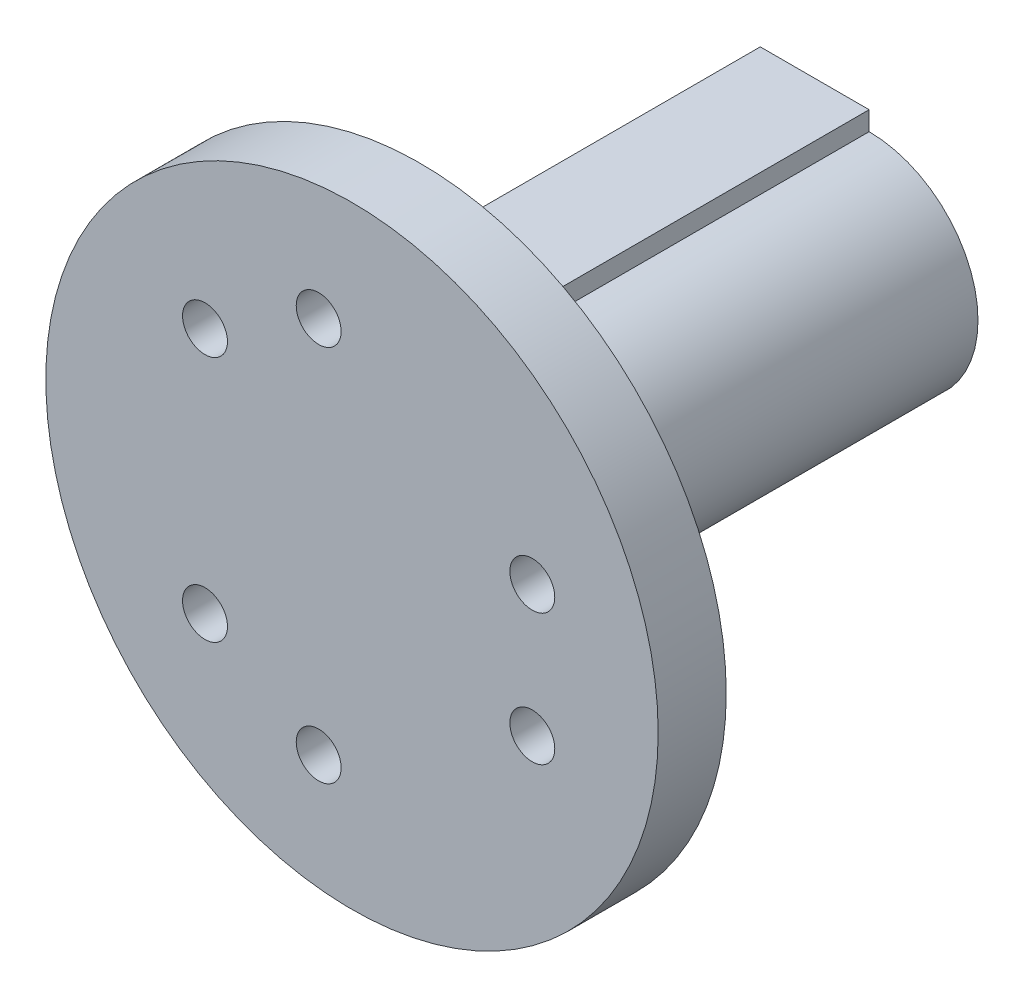
ISO-10303-21;
HEADER;
FILE_DESCRIPTION(('STEP AP214'),'2;1');
FILE_NAME('part.step','',(''),(''),'','','');
FILE_SCHEMA(('AUTOMOTIVE_DESIGN { 1 0 10303 214 1 1 1 1 }'));
ENDSEC;
DATA;
#1=APPLICATION_CONTEXT('core data for automotive mechanical design processes');
#2=APPLICATION_PROTOCOL_DEFINITION('international standard','automotive_design',2000,#1);
#3=PRODUCT_CONTEXT('',#1,'mechanical');
#4=PRODUCT('Part','Part','',(#3));
#5=PRODUCT_RELATED_PRODUCT_CATEGORY('part','',(#4));
#6=PRODUCT_DEFINITION_FORMATION('','',#4);
#7=PRODUCT_DEFINITION_CONTEXT('part definition',#1,'design');
#8=PRODUCT_DEFINITION('design','',#6,#7);
#9=PRODUCT_DEFINITION_SHAPE('','',#8);
#10=(LENGTH_UNIT() NAMED_UNIT(*) SI_UNIT(.MILLI.,.METRE.));
#11=(NAMED_UNIT(*) PLANE_ANGLE_UNIT() SI_UNIT($,.RADIAN.));
#12=(NAMED_UNIT(*) SI_UNIT($,.STERADIAN.) SOLID_ANGLE_UNIT());
#13=UNCERTAINTY_MEASURE_WITH_UNIT(LENGTH_MEASURE(1.E-05),#10,'distance_accuracy_value','');
#14=(GEOMETRIC_REPRESENTATION_CONTEXT(3) GLOBAL_UNCERTAINTY_ASSIGNED_CONTEXT((#13)) GLOBAL_UNIT_ASSIGNED_CONTEXT((#10,
#11,#12)) REPRESENTATION_CONTEXT('',''));
#15=CARTESIAN_POINT('',(0.,0.,0.));
#16=DIRECTION('',(0.,0.,1.));
#17=DIRECTION('',(1.,0.,0.));
#18=AXIS2_PLACEMENT_3D('',#15,#16,#17);
#19=CARTESIAN_POINT('',(0.,0.,-25.));
#20=DIRECTION('',(0.,0.,1.));
#21=DIRECTION('',(1.,0.,0.));
#22=AXIS2_PLACEMENT_3D('',#19,#20,#21);
#23=CYLINDRICAL_SURFACE('',#22,8.);
#24=CARTESIAN_POINT('',(0.,0.,0.));
#25=DIRECTION('',(0.,0.,1.));
#26=DIRECTION('',(1.,0.,0.));
#27=AXIS2_PLACEMENT_3D('',#24,#25,#26);
#28=CIRCLE('',#27,8.);
#29=CARTESIAN_POINT('',(8.,0.,0.));
#30=VERTEX_POINT('',#29);
#31=EDGE_CURVE('E41',#30,#30,#28,.F.);
#32=ORIENTED_EDGE('',*,*,#31,.T.);
#33=EDGE_LOOP('',(#32));
#34=FACE_BOUND('',#33,.T.);
#35=DIRECTION('',(0.,0.,1.));
#36=VECTOR('',#35,1.);
#37=CARTESIAN_POINT('',(0.,-8.,-25.));
#38=LINE('',#37,#36);
#39=CARTESIAN_POINT('',(0.,-8.,-33.));
#40=VERTEX_POINT('',#39);
#41=CARTESIAN_POINT('',(0.,-8.,-10.));
#42=VERTEX_POINT('',#41);
#43=EDGE_CURVE('E141',#40,#42,#38,.T.);
#44=ORIENTED_EDGE('',*,*,#43,.F.);
#45=CARTESIAN_POINT('',(0.,0.,-33.));
#46=DIRECTION('',(0.,0.,-1.));
#47=DIRECTION('',(-1.,0.,0.));
#48=AXIS2_PLACEMENT_3D('',#45,#46,#47);
#49=CIRCLE('',#48,8.);
#50=CARTESIAN_POINT('',(0.,8.,-33.));
#51=VERTEX_POINT('',#50);
#52=EDGE_CURVE('E99',#51,#40,#49,.T.);
#53=ORIENTED_EDGE('',*,*,#52,.F.);
#54=DIRECTION('',(0.,0.,1.));
#55=VECTOR('',#54,1.);
#56=CARTESIAN_POINT('',(0.,8.,-25.));
#57=LINE('',#56,#55);
#58=CARTESIAN_POINT('',(0.,8.,-10.));
#59=VERTEX_POINT('',#58);
#60=EDGE_CURVE('E139',#59,#51,#57,.F.);
#61=ORIENTED_EDGE('',*,*,#60,.F.);
#62=CARTESIAN_POINT('',(0.,0.,-10.));
#63=DIRECTION('',(0.,0.,-1.));
#64=DIRECTION('',(-1.,0.,0.));
#65=AXIS2_PLACEMENT_3D('',#62,#63,#64);
#66=CIRCLE('',#65,8.);
#67=CARTESIAN_POINT('',(-8.,0.,-10.));
#68=VERTEX_POINT('',#67);
#69=EDGE_CURVE('E53',#68,#59,#66,.T.);
#70=ORIENTED_EDGE('',*,*,#69,.F.);
#71=CARTESIAN_POINT('',(0.,0.,-10.));
#72=DIRECTION('',(0.,0.,-1.));
#73=DIRECTION('',(-1.,0.,0.));
#74=AXIS2_PLACEMENT_3D('',#71,#72,#73);
#75=CIRCLE('',#74,8.);
#76=EDGE_CURVE('E11',#42,#68,#75,.T.);
#77=ORIENTED_EDGE('',*,*,#76,.F.);
#78=EDGE_LOOP('',(#44,#53,#61,#70,#77));
#79=FACE_BOUND('',#78,.T.);
#80=ADVANCED_FACE('F33',(#34,#79),#23,.T.);
#81=CARTESIAN_POINT('',(-10.8012266479776,9.06330529658017,5.));
#82=DIRECTION('',(0.,0.,-1.));
#83=DIRECTION('',(-1.,0.,0.));
#84=AXIS2_PLACEMENT_3D('',#81,#82,#83);
#85=CYLINDRICAL_SURFACE('',#84,1.65);
#86=CARTESIAN_POINT('',(-10.8012266479776,9.06330529658017,5.));
#87=DIRECTION('',(0.,0.,1.));
#88=DIRECTION('',(1.,0.,0.));
#89=AXIS2_PLACEMENT_3D('',#86,#87,#88);
#90=CIRCLE('',#89,1.65);
#91=CARTESIAN_POINT('',(-9.15122664797762,9.06330529658017,5.));
#92=VERTEX_POINT('',#91);
#93=EDGE_CURVE('E194',#92,#92,#90,.T.);
#94=ORIENTED_EDGE('',*,*,#93,.T.);
#95=EDGE_LOOP('',(#94));
#96=FACE_BOUND('',#95,.T.);
#97=CARTESIAN_POINT('',(-10.8012266479776,9.06330529658017,2.));
#98=DIRECTION('',(0.,0.,-1.));
#99=DIRECTION('',(-1.,0.,0.));
#100=AXIS2_PLACEMENT_3D('',#97,#98,#99);
#101=CIRCLE('',#100,1.65);
#102=CARTESIAN_POINT('',(-12.4512266479776,9.06330529658017,2.));
#103=VERTEX_POINT('',#102);
#104=EDGE_CURVE('E181',#103,#103,#101,.T.);
#105=ORIENTED_EDGE('',*,*,#104,.T.);
#106=EDGE_LOOP('',(#105));
#107=FACE_BOUND('',#106,.T.);
#108=ADVANCED_FACE('F254',(#96,#107),#85,.F.);
#109=CARTESIAN_POINT('',(13.2496659530816,-4.82248402089022,5.));
#110=DIRECTION('',(0.,0.,-1.));
#111=DIRECTION('',(-1.,0.,0.));
#112=AXIS2_PLACEMENT_3D('',#109,#110,#111);
#113=CYLINDRICAL_SURFACE('',#112,1.65);
#114=CARTESIAN_POINT('',(13.2496659530816,-4.82248402089022,5.));
#115=DIRECTION('',(0.,0.,1.));
#116=DIRECTION('',(1.,0.,0.));
#117=AXIS2_PLACEMENT_3D('',#114,#115,#116);
#118=CIRCLE('',#117,1.65);
#119=CARTESIAN_POINT('',(14.8996659530816,-4.82248402089022,5.));
#120=VERTEX_POINT('',#119);
#121=EDGE_CURVE('E191',#120,#120,#118,.T.);
#122=ORIENTED_EDGE('',*,*,#121,.T.);
#123=EDGE_LOOP('',(#122));
#124=FACE_BOUND('',#123,.T.);
#125=CARTESIAN_POINT('',(13.2496659530816,-4.82248402089022,2.));
#126=DIRECTION('',(0.,0.,-1.));
#127=DIRECTION('',(-1.,0.,0.));
#128=AXIS2_PLACEMENT_3D('',#125,#126,#127);
#129=CIRCLE('',#128,1.65);
#130=CARTESIAN_POINT('',(11.5996659530816,-4.82248402089022,2.));
#131=VERTEX_POINT('',#130);
#132=EDGE_CURVE('E216',#131,#131,#129,.T.);
#133=ORIENTED_EDGE('',*,*,#132,.T.);
#134=EDGE_LOOP('',(#133));
#135=FACE_BOUND('',#134,.T.);
#136=ADVANCED_FACE('F259',(#124,#135),#113,.F.);
#137=CARTESIAN_POINT('',(13.2496659530816,4.82248402089367,5.));
#138=DIRECTION('',(0.,0.,-1.));
#139=DIRECTION('',(-1.,0.,0.));
#140=AXIS2_PLACEMENT_3D('',#137,#138,#139);
#141=CYLINDRICAL_SURFACE('',#140,1.65);
#142=CARTESIAN_POINT('',(13.2496659530816,4.82248402089367,5.));
#143=DIRECTION('',(0.,0.,1.));
#144=DIRECTION('',(1.,0.,0.));
#145=AXIS2_PLACEMENT_3D('',#142,#143,#144);
#146=CIRCLE('',#145,1.65);
#147=CARTESIAN_POINT('',(14.8996659530816,4.82248402089367,5.));
#148=VERTEX_POINT('',#147);
#149=EDGE_CURVE('E188',#148,#148,#146,.T.);
#150=ORIENTED_EDGE('',*,*,#149,.T.);
#151=EDGE_LOOP('',(#150));
#152=FACE_BOUND('',#151,.T.);
#153=CARTESIAN_POINT('',(13.2496659530816,4.82248402089367,2.));
#154=DIRECTION('',(0.,0.,-1.));
#155=DIRECTION('',(-1.,0.,0.));
#156=AXIS2_PLACEMENT_3D('',#153,#154,#155);
#157=CIRCLE('',#156,1.65);
#158=CARTESIAN_POINT('',(11.5996659530816,4.82248402089367,2.));
#159=VERTEX_POINT('',#158);
#160=EDGE_CURVE('E213',#159,#159,#157,.T.);
#161=ORIENTED_EDGE('',*,*,#160,.T.);
#162=EDGE_LOOP('',(#161));
#163=FACE_BOUND('',#162,.T.);
#164=ADVANCED_FACE('F317',(#152,#163),#141,.F.);
#165=CARTESIAN_POINT('',(-10.801226647976,-9.06330529657962,5.));
#166=DIRECTION('',(0.,0.,-1.));
#167=DIRECTION('',(-1.,0.,0.));
#168=AXIS2_PLACEMENT_3D('',#165,#166,#167);
#169=CYLINDRICAL_SURFACE('',#168,1.65);
#170=CARTESIAN_POINT('',(-10.801226647976,-9.06330529657962,5.));
#171=DIRECTION('',(0.,0.,1.));
#172=DIRECTION('',(1.,0.,0.));
#173=AXIS2_PLACEMENT_3D('',#170,#171,#172);
#174=CIRCLE('',#173,1.65);
#175=CARTESIAN_POINT('',(-9.15122664797596,-9.06330529657962,5.));
#176=VERTEX_POINT('',#175);
#177=EDGE_CURVE('E185',#176,#176,#174,.T.);
#178=ORIENTED_EDGE('',*,*,#177,.T.);
#179=EDGE_LOOP('',(#178));
#180=FACE_BOUND('',#179,.T.);
#181=CARTESIAN_POINT('',(-10.801226647976,-9.06330529657962,2.));
#182=DIRECTION('',(0.,0.,-1.));
#183=DIRECTION('',(-1.,0.,0.));
#184=AXIS2_PLACEMENT_3D('',#181,#182,#183);
#185=CIRCLE('',#184,1.65);
#186=CARTESIAN_POINT('',(-12.451226647976,-9.06330529657962,2.));
#187=VERTEX_POINT('',#186);
#188=EDGE_CURVE('E210',#187,#187,#185,.T.);
#189=ORIENTED_EDGE('',*,*,#188,.T.);
#190=EDGE_LOOP('',(#189));
#191=FACE_BOUND('',#190,.T.);
#192=ADVANCED_FACE('F313',(#180,#191),#169,.F.);
#193=CARTESIAN_POINT('',(-2.44843930510205,-13.8857893174715,5.));
#194=DIRECTION('',(0.,0.,-1.));
#195=DIRECTION('',(-1.,0.,0.));
#196=AXIS2_PLACEMENT_3D('',#193,#194,#195);
#197=CYLINDRICAL_SURFACE('',#196,1.65);
#198=CARTESIAN_POINT('',(-2.44843930510205,-13.8857893174715,5.));
#199=DIRECTION('',(0.,0.,1.));
#200=DIRECTION('',(1.,0.,0.));
#201=AXIS2_PLACEMENT_3D('',#198,#199,#200);
#202=CIRCLE('',#201,1.65);
#203=CARTESIAN_POINT('',(-0.798439305102052,-13.8857893174715,5.));
#204=VERTEX_POINT('',#203);
#205=EDGE_CURVE('E182',#204,#204,#202,.T.);
#206=ORIENTED_EDGE('',*,*,#205,.T.);
#207=EDGE_LOOP('',(#206));
#208=FACE_BOUND('',#207,.T.);
#209=CARTESIAN_POINT('',(-2.44843930510205,-13.8857893174715,2.));
#210=DIRECTION('',(0.,0.,-1.));
#211=DIRECTION('',(-1.,0.,0.));
#212=AXIS2_PLACEMENT_3D('',#209,#210,#211);
#213=CIRCLE('',#212,1.65);
#214=CARTESIAN_POINT('',(-4.09843930510205,-13.8857893174715,2.));
#215=VERTEX_POINT('',#214);
#216=EDGE_CURVE('E147',#215,#215,#213,.T.);
#217=ORIENTED_EDGE('',*,*,#216,.T.);
#218=EDGE_LOOP('',(#217));
#219=FACE_BOUND('',#218,.T.);
#220=ADVANCED_FACE('F309',(#208,#219),#197,.F.);
#221=CARTESIAN_POINT('',(-2.44843930510373,13.8857893174721,5.));
#222=DIRECTION('',(0.,0.,-1.));
#223=DIRECTION('',(-1.,0.,0.));
#224=AXIS2_PLACEMENT_3D('',#221,#222,#223);
#225=CYLINDRICAL_SURFACE('',#224,1.65);
#226=CARTESIAN_POINT('',(-2.44843930510373,13.8857893174721,5.));
#227=DIRECTION('',(0.,0.,1.));
#228=DIRECTION('',(1.,0.,0.));
#229=AXIS2_PLACEMENT_3D('',#226,#227,#228);
#230=CIRCLE('',#229,1.65);
#231=CARTESIAN_POINT('',(-0.798439305103731,13.8857893174721,5.));
#232=VERTEX_POINT('',#231);
#233=EDGE_CURVE('E197',#232,#232,#230,.T.);
#234=ORIENTED_EDGE('',*,*,#233,.T.);
#235=EDGE_LOOP('',(#234));
#236=FACE_BOUND('',#235,.T.);
#237=CARTESIAN_POINT('',(-2.44843930510373,13.8857893174721,2.));
#238=DIRECTION('',(0.,0.,-1.));
#239=DIRECTION('',(-1.,0.,0.));
#240=AXIS2_PLACEMENT_3D('',#237,#238,#239);
#241=CIRCLE('',#240,1.65);
#242=CARTESIAN_POINT('',(-4.09843930510373,13.8857893174721,2.));
#243=VERTEX_POINT('',#242);
#244=EDGE_CURVE('E177',#243,#243,#241,.T.);
#245=ORIENTED_EDGE('',*,*,#244,.T.);
#246=EDGE_LOOP('',(#245));
#247=FACE_BOUND('',#246,.T.);
#248=ADVANCED_FACE('F312',(#236,#247),#225,.F.);
#249=CARTESIAN_POINT('',(0.,0.,5.));
#250=DIRECTION('',(0.,0.,1.));
#251=DIRECTION('',(1.,0.,0.));
#252=AXIS2_PLACEMENT_3D('',#249,#250,#251);
#253=PLANE('',#252);
#254=ORIENTED_EDGE('',*,*,#177,.F.);
#255=EDGE_LOOP('',(#254));
#256=FACE_BOUND('',#255,.T.);
#257=ORIENTED_EDGE('',*,*,#121,.F.);
#258=EDGE_LOOP('',(#257));
#259=FACE_BOUND('',#258,.T.);
#260=ORIENTED_EDGE('',*,*,#233,.F.);
#261=EDGE_LOOP('',(#260));
#262=FACE_BOUND('',#261,.T.);
#263=CARTESIAN_POINT('',(0.,0.,5.));
#264=DIRECTION('',(0.,0.,1.));
#265=DIRECTION('',(1.,0.,0.));
#266=AXIS2_PLACEMENT_3D('',#263,#264,#265);
#267=CIRCLE('',#266,22.5);
#268=CARTESIAN_POINT('',(22.5,0.,5.));
#269=VERTEX_POINT('',#268);
#270=EDGE_CURVE('E201',#269,#269,#267,.T.);
#271=ORIENTED_EDGE('',*,*,#270,.T.);
#272=EDGE_LOOP('',(#271));
#273=FACE_BOUND('',#272,.T.);
#274=ORIENTED_EDGE('',*,*,#93,.F.);
#275=EDGE_LOOP('',(#274));
#276=FACE_BOUND('',#275,.T.);
#277=ORIENTED_EDGE('',*,*,#149,.F.);
#278=EDGE_LOOP('',(#277));
#279=FACE_BOUND('',#278,.T.);
#280=ORIENTED_EDGE('',*,*,#205,.F.);
#281=EDGE_LOOP('',(#280));
#282=FACE_BOUND('',#281,.T.);
#283=ADVANCED_FACE('F228',(#256,#259,#262,#273,#276,#279,#282),#253,.T.);
#284=CARTESIAN_POINT('',(0.,0.,0.));
#285=DIRECTION('',(0.,0.,1.));
#286=DIRECTION('',(1.,0.,0.));
#287=AXIS2_PLACEMENT_3D('',#284,#285,#286);
#288=PLANE('',#287);
#289=ORIENTED_EDGE('',*,*,#31,.F.);
#290=EDGE_LOOP('',(#289));
#291=FACE_BOUND('',#290,.T.);
#292=CARTESIAN_POINT('',(-10.8012266479776,9.06330529658017,0.));
#293=DIRECTION('',(0.,0.,-1.));
#294=DIRECTION('',(-1.,0.,0.));
#295=AXIS2_PLACEMENT_3D('',#292,#293,#294);
#296=CIRCLE('',#295,3.);
#297=CARTESIAN_POINT('',(-13.8012266479776,9.06330529658017,0.));
#298=VERTEX_POINT('',#297);
#299=EDGE_CURVE('E148',#298,#298,#296,.T.);
#300=ORIENTED_EDGE('',*,*,#299,.F.);
#301=EDGE_LOOP('',(#300));
#302=FACE_BOUND('',#301,.T.);
#303=CARTESIAN_POINT('',(-10.801226647976,-9.06330529657962,0.));
#304=DIRECTION('',(0.,0.,-1.));
#305=DIRECTION('',(-1.,0.,0.));
#306=AXIS2_PLACEMENT_3D('',#303,#304,#305);
#307=CIRCLE('',#306,3.);
#308=CARTESIAN_POINT('',(-13.801226647976,-9.06330529657962,0.));
#309=VERTEX_POINT('',#308);
#310=EDGE_CURVE('E154',#309,#309,#307,.T.);
#311=ORIENTED_EDGE('',*,*,#310,.F.);
#312=EDGE_LOOP('',(#311));
#313=FACE_BOUND('',#312,.T.);
#314=CARTESIAN_POINT('',(-2.44843930510205,-13.8857893174715,0.));
#315=DIRECTION('',(0.,0.,-1.));
#316=DIRECTION('',(-1.,0.,0.));
#317=AXIS2_PLACEMENT_3D('',#314,#315,#316);
#318=CIRCLE('',#317,3.);
#319=CARTESIAN_POINT('',(-5.44843930510205,-13.8857893174715,0.));
#320=VERTEX_POINT('',#319);
#321=EDGE_CURVE('E160',#320,#320,#318,.T.);
#322=ORIENTED_EDGE('',*,*,#321,.F.);
#323=EDGE_LOOP('',(#322));
#324=FACE_BOUND('',#323,.T.);
#325=CARTESIAN_POINT('',(13.2496659530816,-4.82248402089022,0.));
#326=DIRECTION('',(0.,0.,-1.));
#327=DIRECTION('',(-1.,0.,0.));
#328=AXIS2_PLACEMENT_3D('',#325,#326,#327);
#329=CIRCLE('',#328,3.);
#330=CARTESIAN_POINT('',(10.2496659530816,-4.82248402089022,0.));
#331=VERTEX_POINT('',#330);
#332=EDGE_CURVE('E166',#331,#331,#329,.T.);
#333=ORIENTED_EDGE('',*,*,#332,.F.);
#334=EDGE_LOOP('',(#333));
#335=FACE_BOUND('',#334,.T.);
#336=CARTESIAN_POINT('',(13.2496659530816,4.82248402089367,0.));
#337=DIRECTION('',(0.,0.,-1.));
#338=DIRECTION('',(-1.,0.,0.));
#339=AXIS2_PLACEMENT_3D('',#336,#337,#338);
#340=CIRCLE('',#339,3.);
#341=CARTESIAN_POINT('',(10.2496659530816,4.82248402089367,0.));
#342=VERTEX_POINT('',#341);
#343=EDGE_CURVE('E143',#342,#342,#340,.T.);
#344=ORIENTED_EDGE('',*,*,#343,.F.);
#345=EDGE_LOOP('',(#344));
#346=FACE_BOUND('',#345,.T.);
#347=CARTESIAN_POINT('',(-2.44843930510373,13.8857893174721,0.));
#348=DIRECTION('',(0.,0.,-1.));
#349=DIRECTION('',(-1.,0.,0.));
#350=AXIS2_PLACEMENT_3D('',#347,#348,#349);
#351=CIRCLE('',#350,3.);
#352=CARTESIAN_POINT('',(-5.44843930510373,13.8857893174721,0.));
#353=VERTEX_POINT('',#352);
#354=EDGE_CURVE('E178',#353,#353,#351,.T.);
#355=ORIENTED_EDGE('',*,*,#354,.F.);
#356=EDGE_LOOP('',(#355));
#357=FACE_BOUND('',#356,.T.);
#358=CARTESIAN_POINT('',(0.,0.,0.));
#359=DIRECTION('',(0.,0.,1.));
#360=DIRECTION('',(1.,0.,0.));
#361=AXIS2_PLACEMENT_3D('',#358,#359,#360);
#362=CIRCLE('',#361,22.5);
#363=CARTESIAN_POINT('',(22.5,0.,0.));
#364=VERTEX_POINT('',#363);
#365=EDGE_CURVE('E200',#364,#364,#362,.T.);
#366=ORIENTED_EDGE('',*,*,#365,.F.);
#367=EDGE_LOOP('',(#366));
#368=FACE_BOUND('',#367,.T.);
#369=ADVANCED_FACE('F225',(#291,#302,#313,#324,#335,#346,#357,#368),#288,.F.);
#370=CARTESIAN_POINT('',(0.,0.,5.));
#371=DIRECTION('',(0.,0.,-1.));
#372=DIRECTION('',(-1.,0.,0.));
#373=AXIS2_PLACEMENT_3D('',#370,#371,#372);
#374=CYLINDRICAL_SURFACE('',#373,22.5);
#375=ORIENTED_EDGE('',*,*,#270,.F.);
#376=EDGE_LOOP('',(#375));
#377=FACE_BOUND('',#376,.T.);
#378=ORIENTED_EDGE('',*,*,#365,.T.);
#379=EDGE_LOOP('',(#378));
#380=FACE_BOUND('',#379,.T.);
#381=ADVANCED_FACE('F35',(#377,#380),#374,.T.);
#382=CARTESIAN_POINT('',(-2.44843930510373,13.8857893174721,2.));
#383=DIRECTION('',(0.,0.,-1.));
#384=DIRECTION('',(-1.,0.,0.));
#385=AXIS2_PLACEMENT_3D('',#382,#383,#384);
#386=CYLINDRICAL_SURFACE('',#385,3.);
#387=CARTESIAN_POINT('',(-2.44843930510373,13.8857893174721,2.));
#388=DIRECTION('',(0.,0.,-1.));
#389=DIRECTION('',(-1.,0.,0.));
#390=AXIS2_PLACEMENT_3D('',#387,#388,#389);
#391=CIRCLE('',#390,3.);
#392=CARTESIAN_POINT('',(-5.44843930510373,13.8857893174721,2.));
#393=VERTEX_POINT('',#392);
#394=EDGE_CURVE('E174',#393,#393,#391,.T.);
#395=ORIENTED_EDGE('',*,*,#394,.F.);
#396=EDGE_LOOP('',(#395));
#397=FACE_BOUND('',#396,.T.);
#398=ORIENTED_EDGE('',*,*,#354,.T.);
#399=EDGE_LOOP('',(#398));
#400=FACE_BOUND('',#399,.T.);
#401=ADVANCED_FACE('F244',(#397,#400),#386,.F.);
#402=CARTESIAN_POINT('',(-2.44843930510373,13.8857893174721,2.));
#403=DIRECTION('',(0.,0.,-1.));
#404=DIRECTION('',(-1.,0.,0.));
#405=AXIS2_PLACEMENT_3D('',#402,#403,#404);
#406=PLANE('',#405);
#407=ORIENTED_EDGE('',*,*,#244,.F.);
#408=EDGE_LOOP('',(#407));
#409=FACE_BOUND('',#408,.T.);
#410=ORIENTED_EDGE('',*,*,#394,.T.);
#411=EDGE_LOOP('',(#410));
#412=FACE_BOUND('',#411,.T.);
#413=ADVANCED_FACE('F249',(#409,#412),#406,.T.);
#414=CARTESIAN_POINT('',(-2.44843930510205,-13.8857893174715,2.));
#415=DIRECTION('',(0.,0.,-1.));
#416=DIRECTION('',(-1.,0.,0.));
#417=AXIS2_PLACEMENT_3D('',#414,#415,#416);
#418=CYLINDRICAL_SURFACE('',#417,3.);
#419=CARTESIAN_POINT('',(-2.44843930510205,-13.8857893174715,2.));
#420=DIRECTION('',(0.,0.,-1.));
#421=DIRECTION('',(-1.,0.,0.));
#422=AXIS2_PLACEMENT_3D('',#419,#420,#421);
#423=CIRCLE('',#422,3.);
#424=CARTESIAN_POINT('',(-5.44843930510205,-13.8857893174715,2.));
#425=VERTEX_POINT('',#424);
#426=EDGE_CURVE('E157',#425,#425,#423,.T.);
#427=ORIENTED_EDGE('',*,*,#426,.F.);
#428=EDGE_LOOP('',(#427));
#429=FACE_BOUND('',#428,.T.);
#430=ORIENTED_EDGE('',*,*,#321,.T.);
#431=EDGE_LOOP('',(#430));
#432=FACE_BOUND('',#431,.T.);
#433=ADVANCED_FACE('F287',(#429,#432),#418,.F.);
#434=CARTESIAN_POINT('',(-2.44843930510205,-13.8857893174715,2.));
#435=DIRECTION('',(0.,0.,-1.));
#436=DIRECTION('',(-1.,0.,0.));
#437=AXIS2_PLACEMENT_3D('',#434,#435,#436);
#438=PLANE('',#437);
#439=ORIENTED_EDGE('',*,*,#216,.F.);
#440=EDGE_LOOP('',(#439));
#441=FACE_BOUND('',#440,.T.);
#442=ORIENTED_EDGE('',*,*,#426,.T.);
#443=EDGE_LOOP('',(#442));
#444=FACE_BOUND('',#443,.T.);
#445=ADVANCED_FACE('F283',(#441,#444),#438,.T.);
#446=CARTESIAN_POINT('',(-10.801226647976,-9.06330529657962,2.));
#447=DIRECTION('',(0.,0.,-1.));
#448=DIRECTION('',(-1.,0.,0.));
#449=AXIS2_PLACEMENT_3D('',#446,#447,#448);
#450=CYLINDRICAL_SURFACE('',#449,3.);
#451=CARTESIAN_POINT('',(-10.801226647976,-9.06330529657962,2.));
#452=DIRECTION('',(0.,0.,-1.));
#453=DIRECTION('',(-1.,0.,0.));
#454=AXIS2_PLACEMENT_3D('',#451,#452,#453);
#455=CIRCLE('',#454,3.);
#456=CARTESIAN_POINT('',(-13.801226647976,-9.06330529657962,2.));
#457=VERTEX_POINT('',#456);
#458=EDGE_CURVE('E151',#457,#457,#455,.T.);
#459=ORIENTED_EDGE('',*,*,#458,.F.);
#460=EDGE_LOOP('',(#459));
#461=FACE_BOUND('',#460,.T.);
#462=ORIENTED_EDGE('',*,*,#310,.T.);
#463=EDGE_LOOP('',(#462));
#464=FACE_BOUND('',#463,.T.);
#465=ADVANCED_FACE('F279',(#461,#464),#450,.F.);
#466=CARTESIAN_POINT('',(-10.801226647976,-9.06330529657962,2.));
#467=DIRECTION('',(0.,0.,-1.));
#468=DIRECTION('',(-1.,0.,0.));
#469=AXIS2_PLACEMENT_3D('',#466,#467,#468);
#470=PLANE('',#469);
#471=ORIENTED_EDGE('',*,*,#188,.F.);
#472=EDGE_LOOP('',(#471));
#473=FACE_BOUND('',#472,.T.);
#474=ORIENTED_EDGE('',*,*,#458,.T.);
#475=EDGE_LOOP('',(#474));
#476=FACE_BOUND('',#475,.T.);
#477=ADVANCED_FACE('F275',(#473,#476),#470,.T.);
#478=CARTESIAN_POINT('',(13.2496659530816,4.82248402089367,2.));
#479=DIRECTION('',(0.,0.,-1.));
#480=DIRECTION('',(-1.,0.,0.));
#481=AXIS2_PLACEMENT_3D('',#478,#479,#480);
#482=CYLINDRICAL_SURFACE('',#481,3.);
#483=CARTESIAN_POINT('',(13.2496659530816,4.82248402089367,2.));
#484=DIRECTION('',(0.,0.,-1.));
#485=DIRECTION('',(-1.,0.,0.));
#486=AXIS2_PLACEMENT_3D('',#483,#484,#485);
#487=CIRCLE('',#486,3.);
#488=CARTESIAN_POINT('',(10.2496659530816,4.82248402089367,2.));
#489=VERTEX_POINT('',#488);
#490=EDGE_CURVE('E169',#489,#489,#487,.T.);
#491=ORIENTED_EDGE('',*,*,#490,.F.);
#492=EDGE_LOOP('',(#491));
#493=FACE_BOUND('',#492,.T.);
#494=ORIENTED_EDGE('',*,*,#343,.T.);
#495=EDGE_LOOP('',(#494));
#496=FACE_BOUND('',#495,.T.);
#497=ADVANCED_FACE('F278',(#493,#496),#482,.F.);
#498=CARTESIAN_POINT('',(13.2496659530816,4.82248402089367,2.));
#499=DIRECTION('',(0.,0.,-1.));
#500=DIRECTION('',(-1.,0.,0.));
#501=AXIS2_PLACEMENT_3D('',#498,#499,#500);
#502=PLANE('',#501);
#503=ORIENTED_EDGE('',*,*,#160,.F.);
#504=EDGE_LOOP('',(#503));
#505=FACE_BOUND('',#504,.T.);
#506=ORIENTED_EDGE('',*,*,#490,.T.);
#507=EDGE_LOOP('',(#506));
#508=FACE_BOUND('',#507,.T.);
#509=ADVANCED_FACE('F298',(#505,#508),#502,.T.);
#510=CARTESIAN_POINT('',(13.2496659530816,-4.82248402089022,2.));
#511=DIRECTION('',(0.,0.,-1.));
#512=DIRECTION('',(-1.,0.,0.));
#513=AXIS2_PLACEMENT_3D('',#510,#511,#512);
#514=CYLINDRICAL_SURFACE('',#513,3.);
#515=CARTESIAN_POINT('',(13.2496659530816,-4.82248402089022,2.));
#516=DIRECTION('',(0.,0.,-1.));
#517=DIRECTION('',(-1.,0.,0.));
#518=AXIS2_PLACEMENT_3D('',#515,#516,#517);
#519=CIRCLE('',#518,3.);
#520=CARTESIAN_POINT('',(10.2496659530816,-4.82248402089022,2.));
#521=VERTEX_POINT('',#520);
#522=EDGE_CURVE('E163',#521,#521,#519,.T.);
#523=ORIENTED_EDGE('',*,*,#522,.F.);
#524=EDGE_LOOP('',(#523));
#525=FACE_BOUND('',#524,.T.);
#526=ORIENTED_EDGE('',*,*,#332,.T.);
#527=EDGE_LOOP('',(#526));
#528=FACE_BOUND('',#527,.T.);
#529=ADVANCED_FACE('F294',(#525,#528),#514,.F.);
#530=CARTESIAN_POINT('',(13.2496659530816,-4.82248402089022,2.));
#531=DIRECTION('',(0.,0.,-1.));
#532=DIRECTION('',(-1.,0.,0.));
#533=AXIS2_PLACEMENT_3D('',#530,#531,#532);
#534=PLANE('',#533);
#535=ORIENTED_EDGE('',*,*,#132,.F.);
#536=EDGE_LOOP('',(#535));
#537=FACE_BOUND('',#536,.T.);
#538=ORIENTED_EDGE('',*,*,#522,.T.);
#539=EDGE_LOOP('',(#538));
#540=FACE_BOUND('',#539,.T.);
#541=ADVANCED_FACE('F273',(#537,#540),#534,.T.);
#542=CARTESIAN_POINT('',(-10.8012266479776,9.06330529658017,2.));
#543=DIRECTION('',(0.,0.,-1.));
#544=DIRECTION('',(-1.,0.,0.));
#545=AXIS2_PLACEMENT_3D('',#542,#543,#544);
#546=CYLINDRICAL_SURFACE('',#545,3.);
#547=CARTESIAN_POINT('',(-10.8012266479776,9.06330529658017,2.));
#548=DIRECTION('',(0.,0.,-1.));
#549=DIRECTION('',(-1.,0.,0.));
#550=AXIS2_PLACEMENT_3D('',#547,#548,#549);
#551=CIRCLE('',#550,3.);
#552=CARTESIAN_POINT('',(-13.8012266479776,9.06330529658017,2.));
#553=VERTEX_POINT('',#552);
#554=EDGE_CURVE('E144',#553,#553,#551,.T.);
#555=ORIENTED_EDGE('',*,*,#554,.F.);
#556=EDGE_LOOP('',(#555));
#557=FACE_BOUND('',#556,.T.);
#558=ORIENTED_EDGE('',*,*,#299,.T.);
#559=EDGE_LOOP('',(#558));
#560=FACE_BOUND('',#559,.T.);
#561=ADVANCED_FACE('F269',(#557,#560),#546,.F.);
#562=CARTESIAN_POINT('',(-10.8012266479776,9.06330529658017,2.));
#563=DIRECTION('',(0.,0.,-1.));
#564=DIRECTION('',(-1.,0.,0.));
#565=AXIS2_PLACEMENT_3D('',#562,#563,#564);
#566=PLANE('',#565);
#567=ORIENTED_EDGE('',*,*,#104,.F.);
#568=EDGE_LOOP('',(#567));
#569=FACE_BOUND('',#568,.T.);
#570=ORIENTED_EDGE('',*,*,#554,.T.);
#571=EDGE_LOOP('',(#570));
#572=FACE_BOUND('',#571,.T.);
#573=ADVANCED_FACE('F265',(#569,#572),#566,.T.);
#574=CARTESIAN_POINT('',(0.,0.,0.));
#575=DIRECTION('',(1.,0.,0.));
#576=DIRECTION('',(0.,0.,-1.));
#577=AXIS2_PLACEMENT_3D('',#574,#575,#576);
#578=PLANE('',#577);
#579=ORIENTED_EDGE('',*,*,#60,.T.);
#580=DIRECTION('',(0.,-1.,0.));
#581=VECTOR('',#580,1.);
#582=CARTESIAN_POINT('',(0.,8.,-33.));
#583=LINE('',#582,#581);
#584=CARTESIAN_POINT('',(0.,9.4,-33.));
#585=VERTEX_POINT('',#584);
#586=EDGE_CURVE('E120',#585,#51,#583,.T.);
#587=ORIENTED_EDGE('',*,*,#586,.F.);
#588=DIRECTION('',(0.,0.,-1.));
#589=VECTOR('',#588,1.);
#590=CARTESIAN_POINT('',(0.,9.4,-25.));
#591=LINE('',#590,#589);
#592=CARTESIAN_POINT('',(0.,9.4,-10.));
#593=VERTEX_POINT('',#592);
#594=EDGE_CURVE('E125',#593,#585,#591,.T.);
#595=ORIENTED_EDGE('',*,*,#594,.F.);
#596=DIRECTION('',(0.,1.,0.));
#597=VECTOR('',#596,1.);
#598=CARTESIAN_POINT('',(0.,-9.4,-10.));
#599=LINE('',#598,#597);
#600=EDGE_CURVE('E98',#59,#593,#599,.T.);
#601=ORIENTED_EDGE('',*,*,#600,.F.);
#602=EDGE_LOOP('',(#579,#587,#595,#601));
#603=FACE_BOUND('',#602,.T.);
#604=ADVANCED_FACE('F268',(#603),#578,.T.);
#605=ORIENTED_EDGE('',*,*,#43,.T.);
#606=CARTESIAN_POINT('',(0.,-9.4,-10.));
#607=VERTEX_POINT('',#606);
#608=EDGE_CURVE('E94',#607,#42,#599,.T.);
#609=ORIENTED_EDGE('',*,*,#608,.F.);
#610=DIRECTION('',(0.,0.,1.));
#611=VECTOR('',#610,1.);
#612=CARTESIAN_POINT('',(0.,-9.4,-25.));
#613=LINE('',#612,#611);
#614=CARTESIAN_POINT('',(0.,-9.4,-33.));
#615=VERTEX_POINT('',#614);
#616=EDGE_CURVE('E89',#615,#607,#613,.T.);
#617=ORIENTED_EDGE('',*,*,#616,.F.);
#618=DIRECTION('',(0.,-1.,0.));
#619=VECTOR('',#618,1.);
#620=CARTESIAN_POINT('',(0.,-9.4,-33.));
#621=LINE('',#620,#619);
#622=EDGE_CURVE('E93',#40,#615,#621,.T.);
#623=ORIENTED_EDGE('',*,*,#622,.F.);
#624=EDGE_LOOP('',(#605,#609,#617,#623));
#625=FACE_BOUND('',#624,.T.);
#626=ADVANCED_FACE('F91',(#625),#578,.T.);
#627=CARTESIAN_POINT('',(-8.,-9.4,-10.));
#628=DIRECTION('',(0.,0.,-1.));
#629=DIRECTION('',(-1.,0.,0.));
#630=AXIS2_PLACEMENT_3D('',#627,#628,#629);
#631=PLANE('',#630);
#632=DIRECTION('',(0.,1.,0.));
#633=VECTOR('',#632,1.);
#634=CARTESIAN_POINT('',(-8.,-9.4,-10.));
#635=LINE('',#634,#633);
#636=CARTESIAN_POINT('',(-8.,9.4,-10.));
#637=VERTEX_POINT('',#636);
#638=EDGE_CURVE('E124',#68,#637,#635,.T.);
#639=ORIENTED_EDGE('',*,*,#638,.F.);
#640=ORIENTED_EDGE('',*,*,#69,.T.);
#641=ORIENTED_EDGE('',*,*,#600,.T.);
#642=DIRECTION('',(1.,0.,0.));
#643=VECTOR('',#642,1.);
#644=CARTESIAN_POINT('',(-8.,9.4,-10.));
#645=LINE('',#644,#643);
#646=EDGE_CURVE('E130',#637,#593,#645,.T.);
#647=ORIENTED_EDGE('',*,*,#646,.F.);
#648=EDGE_LOOP('',(#639,#640,#641,#647));
#649=FACE_BOUND('',#648,.T.);
#650=ADVANCED_FACE('F390',(#649),#631,.F.);
#651=ORIENTED_EDGE('',*,*,#608,.T.);
#652=ORIENTED_EDGE('',*,*,#76,.T.);
#653=CARTESIAN_POINT('',(-8.,-9.4,-10.));
#654=VERTEX_POINT('',#653);
#655=EDGE_CURVE('E126',#654,#68,#635,.T.);
#656=ORIENTED_EDGE('',*,*,#655,.F.);
#657=DIRECTION('',(1.,0.,0.));
#658=VECTOR('',#657,1.);
#659=CARTESIAN_POINT('',(-8.,-9.4,-10.));
#660=LINE('',#659,#658);
#661=EDGE_CURVE('E136',#654,#607,#660,.T.);
#662=ORIENTED_EDGE('',*,*,#661,.T.);
#663=EDGE_LOOP('',(#651,#652,#656,#662));
#664=FACE_BOUND('',#663,.T.);
#665=ADVANCED_FACE('F395',(#664),#631,.F.);
#666=CARTESIAN_POINT('',(-8.,-9.4,-25.));
#667=DIRECTION('',(0.,1.,0.));
#668=DIRECTION('',(0.,0.,1.));
#669=AXIS2_PLACEMENT_3D('',#666,#667,#668);
#670=PLANE('',#669);
#671=ORIENTED_EDGE('',*,*,#616,.T.);
#672=ORIENTED_EDGE('',*,*,#661,.F.);
#673=DIRECTION('',(0.,0.,1.));
#674=VECTOR('',#673,1.);
#675=CARTESIAN_POINT('',(-8.,-9.4,-25.));
#676=LINE('',#675,#674);
#677=CARTESIAN_POINT('',(-8.,-9.4,-33.));
#678=VERTEX_POINT('',#677);
#679=EDGE_CURVE('E104',#678,#654,#676,.T.);
#680=ORIENTED_EDGE('',*,*,#679,.F.);
#681=DIRECTION('',(-1.,0.,0.));
#682=VECTOR('',#681,1.);
#683=CARTESIAN_POINT('',(0.,-9.4,-33.));
#684=LINE('',#683,#682);
#685=EDGE_CURVE('E102',#615,#678,#684,.T.);
#686=ORIENTED_EDGE('',*,*,#685,.F.);
#687=EDGE_LOOP('',(#671,#672,#680,#686));
#688=FACE_BOUND('',#687,.T.);
#689=ADVANCED_FACE('F103',(#688),#670,.F.);
#690=CARTESIAN_POINT('',(-8.,9.4,-25.));
#691=DIRECTION('',(0.,-1.,0.));
#692=DIRECTION('',(0.,0.,-1.));
#693=AXIS2_PLACEMENT_3D('',#690,#691,#692);
#694=PLANE('',#693);
#695=ORIENTED_EDGE('',*,*,#594,.T.);
#696=DIRECTION('',(1.,0.,0.));
#697=VECTOR('',#696,1.);
#698=CARTESIAN_POINT('',(0.,9.4,-33.));
#699=LINE('',#698,#697);
#700=CARTESIAN_POINT('',(-8.,9.4,-33.));
#701=VERTEX_POINT('',#700);
#702=EDGE_CURVE('E117',#701,#585,#699,.T.);
#703=ORIENTED_EDGE('',*,*,#702,.F.);
#704=DIRECTION('',(0.,0.,-1.));
#705=VECTOR('',#704,1.);
#706=CARTESIAN_POINT('',(-8.,9.4,-25.));
#707=LINE('',#706,#705);
#708=EDGE_CURVE('E129',#637,#701,#707,.T.);
#709=ORIENTED_EDGE('',*,*,#708,.F.);
#710=ORIENTED_EDGE('',*,*,#646,.T.);
#711=EDGE_LOOP('',(#695,#703,#709,#710));
#712=FACE_BOUND('',#711,.T.);
#713=ADVANCED_FACE('F435',(#712),#694,.F.);
#714=CARTESIAN_POINT('',(-8.,0.,0.));
#715=DIRECTION('',(1.,0.,0.));
#716=DIRECTION('',(0.,0.,-1.));
#717=AXIS2_PLACEMENT_3D('',#714,#715,#716);
#718=PLANE('',#717);
#719=ORIENTED_EDGE('',*,*,#708,.T.);
#720=DIRECTION('',(0.,1.,0.));
#721=VECTOR('',#720,1.);
#722=CARTESIAN_POINT('',(-8.,-9.4,-33.));
#723=LINE('',#722,#721);
#724=EDGE_CURVE('E108',#678,#701,#723,.T.);
#725=ORIENTED_EDGE('',*,*,#724,.F.);
#726=ORIENTED_EDGE('',*,*,#679,.T.);
#727=ORIENTED_EDGE('',*,*,#655,.T.);
#728=ORIENTED_EDGE('',*,*,#638,.T.);
#729=EDGE_LOOP('',(#719,#725,#726,#727,#728));
#730=FACE_BOUND('',#729,.T.);
#731=ADVANCED_FACE('F443',(#730),#718,.F.);
#732=CARTESIAN_POINT('',(0.,0.,-33.));
#733=DIRECTION('',(0.,0.,-1.));
#734=DIRECTION('',(-1.,0.,0.));
#735=AXIS2_PLACEMENT_3D('',#732,#733,#734);
#736=PLANE('',#735);
#737=ORIENTED_EDGE('',*,*,#622,.T.);
#738=ORIENTED_EDGE('',*,*,#685,.T.);
#739=ORIENTED_EDGE('',*,*,#724,.T.);
#740=ORIENTED_EDGE('',*,*,#702,.T.);
#741=ORIENTED_EDGE('',*,*,#586,.T.);
#742=ORIENTED_EDGE('',*,*,#52,.T.);
#743=EDGE_LOOP('',(#737,#738,#739,#740,#741,#742));
#744=FACE_BOUND('',#743,.T.);
#745=ADVANCED_FACE('F111',(#744),#736,.T.);
#746=CLOSED_SHELL('',(#80,#108,#136,#164,#192,#220,#248,#283,#369,#381,#401,#413,#433,#445,#465,
#477,#497,#509,#529,#541,#561,#573,#604,#626,#650,#665,#689,#713,#731,#745));
#747=MANIFOLD_SOLID_BREP('B2',#746);
#748=ADVANCED_BREP_SHAPE_REPRESENTATION('',(#18,#747),#14);
#749=SHAPE_DEFINITION_REPRESENTATION(#9,#748);
ENDSEC;
END-ISO-10303-21;
